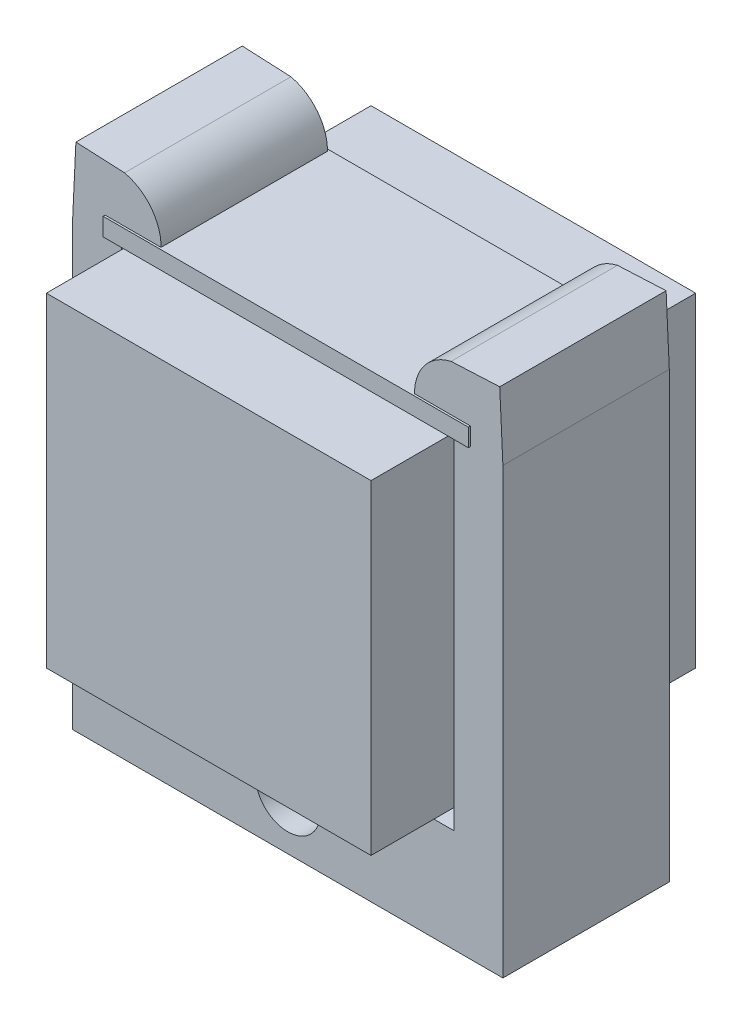
ISO-10303-21;
HEADER;
FILE_DESCRIPTION(('STEP AP214'),'2;1');
FILE_NAME('part.step','',(''),(''),'','','');
FILE_SCHEMA(('AUTOMOTIVE_DESIGN { 1 0 10303 214 1 1 1 1 }'));
ENDSEC;
DATA;
#1=APPLICATION_CONTEXT('core data for automotive mechanical design processes');
#2=APPLICATION_PROTOCOL_DEFINITION('international standard','automotive_design',2000,#1);
#3=PRODUCT_CONTEXT('',#1,'mechanical');
#4=PRODUCT('Part','Part','',(#3));
#5=PRODUCT_RELATED_PRODUCT_CATEGORY('part','',(#4));
#6=PRODUCT_DEFINITION_FORMATION('','',#4);
#7=PRODUCT_DEFINITION_CONTEXT('part definition',#1,'design');
#8=PRODUCT_DEFINITION('design','',#6,#7);
#9=PRODUCT_DEFINITION_SHAPE('','',#8);
#10=(LENGTH_UNIT() NAMED_UNIT(*) SI_UNIT(.MILLI.,.METRE.));
#11=(NAMED_UNIT(*) PLANE_ANGLE_UNIT() SI_UNIT($,.RADIAN.));
#12=(NAMED_UNIT(*) SI_UNIT($,.STERADIAN.) SOLID_ANGLE_UNIT());
#13=UNCERTAINTY_MEASURE_WITH_UNIT(LENGTH_MEASURE(1.E-05),#10,'distance_accuracy_value','');
#14=(GEOMETRIC_REPRESENTATION_CONTEXT(3) GLOBAL_UNCERTAINTY_ASSIGNED_CONTEXT((#13)) GLOBAL_UNIT_ASSIGNED_CONTEXT((#10,
#11,#12)) REPRESENTATION_CONTEXT('',''));
#15=CARTESIAN_POINT('',(0.,0.,0.));
#16=DIRECTION('',(0.,0.,1.));
#17=DIRECTION('',(1.,0.,0.));
#18=AXIS2_PLACEMENT_3D('',#15,#16,#17);
#19=CARTESIAN_POINT('',(-21.4167606150438,2.24614818602984,10.25));
#20=DIRECTION('',(0.,0.,-1.));
#21=DIRECTION('',(-1.,0.,0.));
#22=AXIS2_PLACEMENT_3D('',#19,#20,#21);
#23=CYLINDRICAL_SURFACE('',#22,5.80657591082073);
#24=CARTESIAN_POINT('',(-21.4167606150438,2.24614818602984,-10.25));
#25=DIRECTION('',(0.,0.,1.));
#26=DIRECTION('',(1.,0.,0.));
#27=AXIS2_PLACEMENT_3D('',#24,#25,#26);
#28=CIRCLE('',#27,5.80657591082073);
#29=CARTESIAN_POINT('',(-20.1167569484467,7.90532783284772,-10.25));
#30=VERTEX_POINT('',#29);
#31=CARTESIAN_POINT('',(-15.6167569484467,1.96995753523953,-10.25));
#32=VERTEX_POINT('',#31);
#33=EDGE_CURVE('E199',#30,#32,#28,.F.);
#34=ORIENTED_EDGE('',*,*,#33,.F.);
#35=DIRECTION('',(0.,0.,-1.));
#36=VECTOR('',#35,1.);
#37=CARTESIAN_POINT('',(-20.1167569484467,7.90532783284772,10.25));
#38=LINE('',#37,#36);
#39=CARTESIAN_POINT('',(-20.1167569484467,7.90532783284772,10.25));
#40=VERTEX_POINT('',#39);
#41=EDGE_CURVE('E12',#40,#30,#38,.T.);
#42=ORIENTED_EDGE('',*,*,#41,.F.);
#43=CARTESIAN_POINT('',(-21.4167606150438,2.24614818602984,10.25));
#44=DIRECTION('',(0.,0.,1.));
#45=DIRECTION('',(1.,0.,0.));
#46=AXIS2_PLACEMENT_3D('',#43,#44,#45);
#47=CIRCLE('',#46,5.80657591082073);
#48=CARTESIAN_POINT('',(-15.6167569484467,1.96995753523953,10.25));
#49=VERTEX_POINT('',#48);
#50=EDGE_CURVE('E242',#40,#49,#47,.F.);
#51=ORIENTED_EDGE('',*,*,#50,.T.);
#52=DIRECTION('',(0.,0.,-1.));
#53=VECTOR('',#52,1.);
#54=CARTESIAN_POINT('',(-15.6167569484467,1.96995753523953,10.25));
#55=LINE('',#54,#53);
#56=EDGE_CURVE('E70',#49,#32,#55,.T.);
#57=ORIENTED_EDGE('',*,*,#56,.T.);
#58=EDGE_LOOP('',(#34,#42,#51,#57));
#59=FACE_BOUND('',#58,.T.);
#60=ADVANCED_FACE('F54',(#59),#23,.T.);
#61=CARTESIAN_POINT('',(0.330079474075437,6.93166895558486,10.25));
#62=DIRECTION('',(0.0475651494154447,0.998868137724438,0.));
#63=DIRECTION('',(-0.998868137724438,0.0475651494154447,0.));
#64=AXIS2_PLACEMENT_3D('',#61,#62,#63);
#65=PLANE('',#64);
#66=DIRECTION('',(0.998868137724438,-0.0475651494154447,0.));
#67=VECTOR('',#66,1.);
#68=CARTESIAN_POINT('',(0.330079474075437,6.93166895558486,-10.25));
#69=LINE('',#68,#67);
#70=CARTESIAN_POINT('',(-26.1099657747934,8.19071872934039,-10.25));
#71=VERTEX_POINT('',#70);
#72=EDGE_CURVE('E201',#71,#30,#69,.T.);
#73=ORIENTED_EDGE('',*,*,#72,.F.);
#74=DIRECTION('',(0.,0.,-1.));
#75=VECTOR('',#74,1.);
#76=CARTESIAN_POINT('',(-26.1099657747934,8.19071872934039,10.25));
#77=LINE('',#76,#75);
#78=CARTESIAN_POINT('',(-26.1099657747934,8.19071872934039,10.25));
#79=VERTEX_POINT('',#78);
#80=EDGE_CURVE('E62',#79,#71,#77,.T.);
#81=ORIENTED_EDGE('',*,*,#80,.F.);
#82=DIRECTION('',(0.998868137724438,-0.0475651494154447,0.));
#83=VECTOR('',#82,1.);
#84=CARTESIAN_POINT('',(0.330079474075437,6.93166895558486,10.25));
#85=LINE('',#84,#83);
#86=EDGE_CURVE('E293',#79,#40,#85,.T.);
#87=ORIENTED_EDGE('',*,*,#86,.T.);
#88=ORIENTED_EDGE('',*,*,#41,.T.);
#89=EDGE_LOOP('',(#73,#81,#87,#88));
#90=FACE_BOUND('',#89,.T.);
#91=ADVANCED_FACE('F279',(#90),#65,.T.);
#92=CARTESIAN_POINT('',(-26.4400452488688,1.25904977375553,10.25));
#93=DIRECTION('',(-0.998868137724438,0.0475651494154446,0.));
#94=DIRECTION('',(-0.0475651494154446,-0.998868137724438,0.));
#95=AXIS2_PLACEMENT_3D('',#92,#93,#94);
#96=PLANE('',#95);
#97=DIRECTION('',(0.0475651494154446,0.998868137724438,0.));
#98=VECTOR('',#97,1.);
#99=CARTESIAN_POINT('',(-26.4400452488688,1.25904977375553,-10.25));
#100=LINE('',#99,#98);
#101=CARTESIAN_POINT('',(-26.5,0.,-10.25));
#102=VERTEX_POINT('',#101);
#103=EDGE_CURVE('E204',#102,#71,#100,.T.);
#104=ORIENTED_EDGE('',*,*,#103,.F.);
#105=DIRECTION('',(0.,0.,-1.));
#106=VECTOR('',#105,1.);
#107=CARTESIAN_POINT('',(-26.5,0.,10.25));
#108=LINE('',#107,#106);
#109=CARTESIAN_POINT('',(-26.5,0.,10.25));
#110=VERTEX_POINT('',#109);
#111=EDGE_CURVE('E268',#110,#102,#108,.T.);
#112=ORIENTED_EDGE('',*,*,#111,.F.);
#113=DIRECTION('',(0.0475651494154446,0.998868137724438,0.));
#114=VECTOR('',#113,1.);
#115=CARTESIAN_POINT('',(-26.4400452488688,1.25904977375553,10.25));
#116=LINE('',#115,#114);
#117=EDGE_CURVE('E275',#110,#79,#116,.T.);
#118=ORIENTED_EDGE('',*,*,#117,.T.);
#119=ORIENTED_EDGE('',*,*,#80,.T.);
#120=EDGE_LOOP('',(#104,#112,#118,#119));
#121=FACE_BOUND('',#120,.T.);
#122=ADVANCED_FACE('F273',(#121),#96,.T.);
#123=CARTESIAN_POINT('',(-26.5,0.,10.25));
#124=DIRECTION('',(-1.,0.,0.));
#125=DIRECTION('',(0.,0.,1.));
#126=AXIS2_PLACEMENT_3D('',#123,#124,#125);
#127=PLANE('',#126);
#128=DIRECTION('',(0.,1.,0.));
#129=VECTOR('',#128,1.);
#130=CARTESIAN_POINT('',(-26.5,0.,-10.25));
#131=LINE('',#130,#129);
#132=CARTESIAN_POINT('',(-26.5,-54.7,-10.25));
#133=VERTEX_POINT('',#132);
#134=EDGE_CURVE('E207',#133,#102,#131,.T.);
#135=ORIENTED_EDGE('',*,*,#134,.F.);
#136=DIRECTION('',(0.,0.,-1.));
#137=VECTOR('',#136,1.);
#138=CARTESIAN_POINT('',(-26.5,-54.7,10.25));
#139=LINE('',#138,#137);
#140=CARTESIAN_POINT('',(-26.5,-54.7,10.25));
#141=VERTEX_POINT('',#140);
#142=EDGE_CURVE('E266',#141,#133,#139,.T.);
#143=ORIENTED_EDGE('',*,*,#142,.F.);
#144=DIRECTION('',(0.,1.,0.));
#145=VECTOR('',#144,1.);
#146=CARTESIAN_POINT('',(-26.5,0.,10.25));
#147=LINE('',#146,#145);
#148=EDGE_CURVE('E290',#141,#110,#147,.T.);
#149=ORIENTED_EDGE('',*,*,#148,.T.);
#150=ORIENTED_EDGE('',*,*,#111,.T.);
#151=EDGE_LOOP('',(#135,#143,#149,#150));
#152=FACE_BOUND('',#151,.T.);
#153=ADVANCED_FACE('F287',(#152),#127,.T.);
#154=CARTESIAN_POINT('',(0.,-54.7,10.25));
#155=DIRECTION('',(0.,-1.,0.));
#156=DIRECTION('',(0.,0.,-1.));
#157=AXIS2_PLACEMENT_3D('',#154,#155,#156);
#158=PLANE('',#157);
#159=DIRECTION('',(-1.,0.,0.));
#160=VECTOR('',#159,1.);
#161=CARTESIAN_POINT('',(0.,-54.7,-10.25));
#162=LINE('',#161,#160);
#163=CARTESIAN_POINT('',(26.5,-54.7,-10.25));
#164=VERTEX_POINT('',#163);
#165=EDGE_CURVE('E210',#164,#133,#162,.T.);
#166=ORIENTED_EDGE('',*,*,#165,.F.);
#167=DIRECTION('',(0.,0.,-1.));
#168=VECTOR('',#167,1.);
#169=CARTESIAN_POINT('',(26.5,-54.7,10.25));
#170=LINE('',#169,#168);
#171=CARTESIAN_POINT('',(26.5,-54.7,10.25));
#172=VERTEX_POINT('',#171);
#173=EDGE_CURVE('E264',#172,#164,#170,.T.);
#174=ORIENTED_EDGE('',*,*,#173,.F.);
#175=DIRECTION('',(-1.,0.,0.));
#176=VECTOR('',#175,1.);
#177=CARTESIAN_POINT('',(0.,-54.7,10.25));
#178=LINE('',#177,#176);
#179=EDGE_CURVE('E295',#172,#141,#178,.T.);
#180=ORIENTED_EDGE('',*,*,#179,.T.);
#181=ORIENTED_EDGE('',*,*,#142,.T.);
#182=EDGE_LOOP('',(#166,#174,#180,#181));
#183=FACE_BOUND('',#182,.T.);
#184=ADVANCED_FACE('F342',(#183),#158,.T.);
#185=CARTESIAN_POINT('',(26.5,0.,10.25));
#186=DIRECTION('',(-1.,0.,0.));
#187=DIRECTION('',(0.,0.,1.));
#188=AXIS2_PLACEMENT_3D('',#185,#186,#187);
#189=PLANE('',#188);
#190=DIRECTION('',(0.,1.,0.));
#191=VECTOR('',#190,1.);
#192=CARTESIAN_POINT('',(26.5,0.,-10.25));
#193=LINE('',#192,#191);
#194=CARTESIAN_POINT('',(26.5,0.,-10.25));
#195=VERTEX_POINT('',#194);
#196=EDGE_CURVE('E213',#164,#195,#193,.T.);
#197=ORIENTED_EDGE('',*,*,#196,.T.);
#198=DIRECTION('',(0.,0.,-1.));
#199=VECTOR('',#198,1.);
#200=CARTESIAN_POINT('',(26.5,0.,10.25));
#201=LINE('',#200,#199);
#202=CARTESIAN_POINT('',(26.5,0.,10.25));
#203=VERTEX_POINT('',#202);
#204=EDGE_CURVE('E261',#203,#195,#201,.T.);
#205=ORIENTED_EDGE('',*,*,#204,.F.);
#206=DIRECTION('',(0.,1.,0.));
#207=VECTOR('',#206,1.);
#208=CARTESIAN_POINT('',(26.5,0.,10.25));
#209=LINE('',#208,#207);
#210=EDGE_CURVE('E301',#172,#203,#209,.T.);
#211=ORIENTED_EDGE('',*,*,#210,.F.);
#212=ORIENTED_EDGE('',*,*,#173,.T.);
#213=EDGE_LOOP('',(#197,#205,#211,#212));
#214=FACE_BOUND('',#213,.T.);
#215=ADVANCED_FACE('F345',(#214),#189,.F.);
#216=CARTESIAN_POINT('',(26.4400452488688,1.25904977375553,10.25));
#217=DIRECTION('',(-0.998868137724438,-0.0475651494154446,0.));
#218=DIRECTION('',(0.0475651494154446,-0.998868137724438,0.));
#219=AXIS2_PLACEMENT_3D('',#216,#217,#218);
#220=PLANE('',#219);
#221=DIRECTION('',(-0.0475651494154446,0.998868137724438,0.));
#222=VECTOR('',#221,1.);
#223=CARTESIAN_POINT('',(26.4400452488688,1.25904977375553,-10.25));
#224=LINE('',#223,#222);
#225=CARTESIAN_POINT('',(26.1099657747934,8.19071872934039,-10.25));
#226=VERTEX_POINT('',#225);
#227=EDGE_CURVE('E215',#195,#226,#224,.T.);
#228=ORIENTED_EDGE('',*,*,#227,.T.);
#229=DIRECTION('',(0.,0.,-1.));
#230=VECTOR('',#229,1.);
#231=CARTESIAN_POINT('',(26.1099657747934,8.19071872934039,10.25));
#232=LINE('',#231,#230);
#233=CARTESIAN_POINT('',(26.1099657747934,8.19071872934039,10.25));
#234=VERTEX_POINT('',#233);
#235=EDGE_CURVE('E258',#234,#226,#232,.T.);
#236=ORIENTED_EDGE('',*,*,#235,.F.);
#237=DIRECTION('',(-0.0475651494154446,0.998868137724438,0.));
#238=VECTOR('',#237,1.);
#239=CARTESIAN_POINT('',(26.4400452488688,1.25904977375553,10.25));
#240=LINE('',#239,#238);
#241=EDGE_CURVE('E303',#203,#234,#240,.T.);
#242=ORIENTED_EDGE('',*,*,#241,.F.);
#243=ORIENTED_EDGE('',*,*,#204,.T.);
#244=EDGE_LOOP('',(#228,#236,#242,#243));
#245=FACE_BOUND('',#244,.T.);
#246=ADVANCED_FACE('F349',(#245),#220,.F.);
#247=CARTESIAN_POINT('',(-0.330079474075437,6.93166895558486,10.25));
#248=DIRECTION('',(0.0475651494154447,-0.998868137724438,0.));
#249=DIRECTION('',(0.998868137724438,0.0475651494154447,0.));
#250=AXIS2_PLACEMENT_3D('',#247,#248,#249);
#251=PLANE('',#250);
#252=DIRECTION('',(-0.998868137724438,-0.0475651494154447,0.));
#253=VECTOR('',#252,1.);
#254=CARTESIAN_POINT('',(-0.330079474075437,6.93166895558486,-10.25));
#255=LINE('',#254,#253);
#256=CARTESIAN_POINT('',(20.1167569484467,7.90532783284772,-10.25));
#257=VERTEX_POINT('',#256);
#258=EDGE_CURVE('E217',#226,#257,#255,.T.);
#259=ORIENTED_EDGE('',*,*,#258,.T.);
#260=DIRECTION('',(0.,0.,-1.));
#261=VECTOR('',#260,1.);
#262=CARTESIAN_POINT('',(20.1167569484467,7.90532783284772,10.25));
#263=LINE('',#262,#261);
#264=CARTESIAN_POINT('',(20.1167569484467,7.90532783284772,10.25));
#265=VERTEX_POINT('',#264);
#266=EDGE_CURVE('E255',#265,#257,#263,.T.);
#267=ORIENTED_EDGE('',*,*,#266,.F.);
#268=DIRECTION('',(-0.998868137724438,-0.0475651494154447,0.));
#269=VECTOR('',#268,1.);
#270=CARTESIAN_POINT('',(-0.330079474075437,6.93166895558486,10.25));
#271=LINE('',#270,#269);
#272=EDGE_CURVE('E305',#234,#265,#271,.T.);
#273=ORIENTED_EDGE('',*,*,#272,.F.);
#274=ORIENTED_EDGE('',*,*,#235,.T.);
#275=EDGE_LOOP('',(#259,#267,#273,#274));
#276=FACE_BOUND('',#275,.T.);
#277=ADVANCED_FACE('F353',(#276),#251,.F.);
#278=CARTESIAN_POINT('',(21.4167606150438,2.24614818602984,10.25));
#279=DIRECTION('',(0.,0.,-1.));
#280=DIRECTION('',(-1.,0.,0.));
#281=AXIS2_PLACEMENT_3D('',#278,#279,#280);
#282=CYLINDRICAL_SURFACE('',#281,5.80657591082073);
#283=CARTESIAN_POINT('',(21.4167606150438,2.24614818602984,-10.25));
#284=DIRECTION('',(0.,0.,1.));
#285=DIRECTION('',(1.,0.,0.));
#286=AXIS2_PLACEMENT_3D('',#283,#284,#285);
#287=CIRCLE('',#286,5.80657591082073);
#288=CARTESIAN_POINT('',(15.6167569484467,1.96995753523953,-10.25));
#289=VERTEX_POINT('',#288);
#290=EDGE_CURVE('E219',#257,#289,#287,.T.);
#291=ORIENTED_EDGE('',*,*,#290,.T.);
#292=DIRECTION('',(0.,0.,-1.));
#293=VECTOR('',#292,1.);
#294=CARTESIAN_POINT('',(15.6167569484467,1.96995753523953,10.25));
#295=LINE('',#294,#293);
#296=CARTESIAN_POINT('',(15.6167569484467,1.96995753523953,10.25));
#297=VERTEX_POINT('',#296);
#298=EDGE_CURVE('E252',#297,#289,#295,.T.);
#299=ORIENTED_EDGE('',*,*,#298,.F.);
#300=CARTESIAN_POINT('',(21.4167606150438,2.24614818602984,10.25));
#301=DIRECTION('',(0.,0.,1.));
#302=DIRECTION('',(1.,0.,0.));
#303=AXIS2_PLACEMENT_3D('',#300,#301,#302);
#304=CIRCLE('',#303,5.80657591082073);
#305=EDGE_CURVE('E307',#265,#297,#304,.T.);
#306=ORIENTED_EDGE('',*,*,#305,.F.);
#307=ORIENTED_EDGE('',*,*,#266,.T.);
#308=EDGE_LOOP('',(#291,#299,#306,#307));
#309=FACE_BOUND('',#308,.T.);
#310=ADVANCED_FACE('F357',(#309),#282,.T.);
#311=CARTESIAN_POINT('',(-0.0582632382162501,1.22352800254136,10.25));
#312=DIRECTION('',(-0.0475651494154451,0.998868137724438,0.));
#313=DIRECTION('',(-0.998868137724438,-0.0475651494154451,0.));
#314=AXIS2_PLACEMENT_3D('',#311,#312,#313);
#315=PLANE('',#314);
#316=DIRECTION('',(0.998868137724438,0.0475651494154451,0.));
#317=VECTOR('',#316,1.);
#318=CARTESIAN_POINT('',(-0.0582632382162501,1.22352800254136,-10.25));
#319=LINE('',#318,#317);
#320=CARTESIAN_POINT('',(20.395356671286,2.19750990299376,-10.25));
#321=VERTEX_POINT('',#320);
#322=EDGE_CURVE('E221',#289,#321,#319,.T.);
#323=ORIENTED_EDGE('',*,*,#322,.T.);
#324=DIRECTION('',(0.,0.,-1.));
#325=VECTOR('',#324,1.);
#326=CARTESIAN_POINT('',(20.395356671286,2.19750990299376,10.25));
#327=LINE('',#326,#325);
#328=CARTESIAN_POINT('',(20.395356671286,2.19750990299376,10.25));
#329=VERTEX_POINT('',#328);
#330=EDGE_CURVE('E250',#329,#321,#327,.T.);
#331=ORIENTED_EDGE('',*,*,#330,.F.);
#332=DIRECTION('',(0.998868137724438,0.0475651494154451,0.));
#333=VECTOR('',#332,1.);
#334=CARTESIAN_POINT('',(-0.0582632382162501,1.22352800254136,10.25));
#335=LINE('',#334,#333);
#336=EDGE_CURVE('E309',#297,#329,#335,.T.);
#337=ORIENTED_EDGE('',*,*,#336,.F.);
#338=ORIENTED_EDGE('',*,*,#298,.T.);
#339=EDGE_LOOP('',(#323,#331,#337,#338));
#340=FACE_BOUND('',#339,.T.);
#341=ADVANCED_FACE('F361',(#340),#315,.F.);
#342=CARTESIAN_POINT('',(20.4536199095023,0.973981900452354,10.25));
#343=DIRECTION('',(-0.998868137724438,-0.0475651494154428,0.));
#344=DIRECTION('',(0.0475651494154428,-0.998868137724438,0.));
#345=AXIS2_PLACEMENT_3D('',#342,#343,#344);
#346=PLANE('',#345);
#347=DIRECTION('',(-0.0475651494154428,0.998868137724438,0.));
#348=VECTOR('',#347,1.);
#349=CARTESIAN_POINT('',(20.4536199095023,0.973981900452354,-10.25));
#350=LINE('',#349,#348);
#351=CARTESIAN_POINT('',(20.5,0.,-10.25));
#352=VERTEX_POINT('',#351);
#353=EDGE_CURVE('E224',#352,#321,#350,.T.);
#354=ORIENTED_EDGE('',*,*,#353,.F.);
#355=DIRECTION('',(0.,0.,-1.));
#356=VECTOR('',#355,1.);
#357=CARTESIAN_POINT('',(20.5,0.,10.25));
#358=LINE('',#357,#356);
#359=CARTESIAN_POINT('',(20.5,0.,10.25));
#360=VERTEX_POINT('',#359);
#361=EDGE_CURVE('E248',#360,#352,#358,.T.);
#362=ORIENTED_EDGE('',*,*,#361,.F.);
#363=DIRECTION('',(-0.0475651494154428,0.998868137724438,0.));
#364=VECTOR('',#363,1.);
#365=CARTESIAN_POINT('',(20.4536199095023,0.973981900452354,10.25));
#366=LINE('',#365,#364);
#367=EDGE_CURVE('E311',#360,#329,#366,.T.);
#368=ORIENTED_EDGE('',*,*,#367,.T.);
#369=ORIENTED_EDGE('',*,*,#330,.T.);
#370=EDGE_LOOP('',(#354,#362,#368,#369));
#371=FACE_BOUND('',#370,.T.);
#372=ADVANCED_FACE('F365',(#371),#346,.T.);
#373=CARTESIAN_POINT('',(20.5,0.,10.25));
#374=DIRECTION('',(-1.,0.,0.));
#375=DIRECTION('',(0.,0.,1.));
#376=AXIS2_PLACEMENT_3D('',#373,#374,#375);
#377=PLANE('',#376);
#378=DIRECTION('',(0.,1.,0.));
#379=VECTOR('',#378,1.);
#380=CARTESIAN_POINT('',(20.5,0.,-10.25));
#381=LINE('',#380,#379);
#382=CARTESIAN_POINT('',(20.5,-42.,-10.25));
#383=VERTEX_POINT('',#382);
#384=EDGE_CURVE('E227',#383,#352,#381,.T.);
#385=ORIENTED_EDGE('',*,*,#384,.F.);
#386=DIRECTION('',(0.,0.,-1.));
#387=VECTOR('',#386,1.);
#388=CARTESIAN_POINT('',(20.5,-42.,10.25));
#389=LINE('',#388,#387);
#390=CARTESIAN_POINT('',(20.5,-42.,10.25));
#391=VERTEX_POINT('',#390);
#392=EDGE_CURVE('E246',#391,#383,#389,.T.);
#393=ORIENTED_EDGE('',*,*,#392,.F.);
#394=DIRECTION('',(0.,1.,0.));
#395=VECTOR('',#394,1.);
#396=CARTESIAN_POINT('',(20.5,0.,10.25));
#397=LINE('',#396,#395);
#398=EDGE_CURVE('E314',#391,#360,#397,.T.);
#399=ORIENTED_EDGE('',*,*,#398,.T.);
#400=ORIENTED_EDGE('',*,*,#361,.T.);
#401=EDGE_LOOP('',(#385,#393,#399,#400));
#402=FACE_BOUND('',#401,.T.);
#403=ADVANCED_FACE('F369',(#402),#377,.T.);
#404=CARTESIAN_POINT('',(0.,-42.,10.25));
#405=DIRECTION('',(0.,1.,0.));
#406=DIRECTION('',(0.,0.,1.));
#407=AXIS2_PLACEMENT_3D('',#404,#405,#406);
#408=PLANE('',#407);
#409=DIRECTION('',(1.,0.,0.));
#410=VECTOR('',#409,1.);
#411=CARTESIAN_POINT('',(0.,-42.,-10.25));
#412=LINE('',#411,#410);
#413=CARTESIAN_POINT('',(-20.5,-42.,-10.25));
#414=VERTEX_POINT('',#413);
#415=EDGE_CURVE('E230',#414,#383,#412,.T.);
#416=ORIENTED_EDGE('',*,*,#415,.F.);
#417=DIRECTION('',(0.,0.,-1.));
#418=VECTOR('',#417,1.);
#419=CARTESIAN_POINT('',(-20.5,-42.,10.25));
#420=LINE('',#419,#418);
#421=CARTESIAN_POINT('',(-20.5,-42.,10.25));
#422=VERTEX_POINT('',#421);
#423=EDGE_CURVE('E188',#422,#414,#420,.T.);
#424=ORIENTED_EDGE('',*,*,#423,.F.);
#425=DIRECTION('',(1.,0.,0.));
#426=VECTOR('',#425,1.);
#427=CARTESIAN_POINT('',(0.,-42.,10.25));
#428=LINE('',#427,#426);
#429=EDGE_CURVE('E178',#422,#391,#428,.T.);
#430=ORIENTED_EDGE('',*,*,#429,.T.);
#431=ORIENTED_EDGE('',*,*,#392,.T.);
#432=EDGE_LOOP('',(#416,#424,#430,#431));
#433=FACE_BOUND('',#432,.T.);
#434=ADVANCED_FACE('F318',(#433),#408,.T.);
#435=CARTESIAN_POINT('',(-20.5,0.,10.25));
#436=DIRECTION('',(-1.,0.,0.));
#437=DIRECTION('',(0.,0.,1.));
#438=AXIS2_PLACEMENT_3D('',#435,#436,#437);
#439=PLANE('',#438);
#440=DIRECTION('',(0.,1.,0.));
#441=VECTOR('',#440,1.);
#442=CARTESIAN_POINT('',(-20.5,0.,-10.25));
#443=LINE('',#442,#441);
#444=CARTESIAN_POINT('',(-20.5,0.,-10.25));
#445=VERTEX_POINT('',#444);
#446=EDGE_CURVE('E185',#414,#445,#443,.T.);
#447=ORIENTED_EDGE('',*,*,#446,.T.);
#448=DIRECTION('',(0.,0.,-1.));
#449=VECTOR('',#448,1.);
#450=CARTESIAN_POINT('',(-20.5,0.,10.25));
#451=LINE('',#450,#449);
#452=CARTESIAN_POINT('',(-20.5,0.,10.25));
#453=VERTEX_POINT('',#452);
#454=EDGE_CURVE('E182',#453,#445,#451,.T.);
#455=ORIENTED_EDGE('',*,*,#454,.F.);
#456=DIRECTION('',(0.,1.,0.));
#457=VECTOR('',#456,1.);
#458=CARTESIAN_POINT('',(-20.5,0.,10.25));
#459=LINE('',#458,#457);
#460=EDGE_CURVE('E169',#422,#453,#459,.T.);
#461=ORIENTED_EDGE('',*,*,#460,.F.);
#462=ORIENTED_EDGE('',*,*,#423,.T.);
#463=EDGE_LOOP('',(#447,#455,#461,#462));
#464=FACE_BOUND('',#463,.T.);
#465=ADVANCED_FACE('F183',(#464),#439,.F.);
#466=CARTESIAN_POINT('',(-20.4536199095023,0.973981900452354,10.25));
#467=DIRECTION('',(-0.998868137724438,0.0475651494154428,0.));
#468=DIRECTION('',(-0.0475651494154428,-0.998868137724438,0.));
#469=AXIS2_PLACEMENT_3D('',#466,#467,#468);
#470=PLANE('',#469);
#471=DIRECTION('',(0.0475651494154428,0.998868137724438,0.));
#472=VECTOR('',#471,1.);
#473=CARTESIAN_POINT('',(-20.4536199095023,0.973981900452354,-10.25));
#474=LINE('',#473,#472);
#475=CARTESIAN_POINT('',(-20.395356671286,2.19750990299376,-10.25));
#476=VERTEX_POINT('',#475);
#477=EDGE_CURVE('E234',#445,#476,#474,.T.);
#478=ORIENTED_EDGE('',*,*,#477,.T.);
#479=DIRECTION('',(0.,0.,-1.));
#480=VECTOR('',#479,1.);
#481=CARTESIAN_POINT('',(-20.395356671286,2.19750990299376,10.25));
#482=LINE('',#481,#480);
#483=CARTESIAN_POINT('',(-20.395356671286,2.19750990299376,10.25));
#484=VERTEX_POINT('',#483);
#485=EDGE_CURVE('E120',#484,#476,#482,.T.);
#486=ORIENTED_EDGE('',*,*,#485,.F.);
#487=DIRECTION('',(0.0475651494154428,0.998868137724438,0.));
#488=VECTOR('',#487,1.);
#489=CARTESIAN_POINT('',(-20.4536199095023,0.973981900452354,10.25));
#490=LINE('',#489,#488);
#491=EDGE_CURVE('E175',#453,#484,#490,.T.);
#492=ORIENTED_EDGE('',*,*,#491,.F.);
#493=ORIENTED_EDGE('',*,*,#454,.T.);
#494=EDGE_LOOP('',(#478,#486,#492,#493));
#495=FACE_BOUND('',#494,.T.);
#496=ADVANCED_FACE('F190',(#495),#470,.F.);
#497=CARTESIAN_POINT('',(0.0582632382162501,1.22352800254136,10.25));
#498=DIRECTION('',(-0.0475651494154451,-0.998868137724438,0.));
#499=DIRECTION('',(0.998868137724438,-0.0475651494154451,0.));
#500=AXIS2_PLACEMENT_3D('',#497,#498,#499);
#501=PLANE('',#500);
#502=DIRECTION('',(-0.998868137724438,0.0475651494154451,0.));
#503=VECTOR('',#502,1.);
#504=CARTESIAN_POINT('',(0.0582632382162501,1.22352800254136,-10.25));
#505=LINE('',#504,#503);
#506=EDGE_CURVE('E236',#32,#476,#505,.T.);
#507=ORIENTED_EDGE('',*,*,#506,.F.);
#508=ORIENTED_EDGE('',*,*,#56,.F.);
#509=DIRECTION('',(-0.998868137724438,0.0475651494154451,0.));
#510=VECTOR('',#509,1.);
#511=CARTESIAN_POINT('',(0.0582632382162501,1.22352800254136,10.25));
#512=LINE('',#511,#510);
#513=EDGE_CURVE('E191',#49,#484,#512,.T.);
#514=ORIENTED_EDGE('',*,*,#513,.T.);
#515=ORIENTED_EDGE('',*,*,#485,.T.);
#516=EDGE_LOOP('',(#507,#508,#514,#515));
#517=FACE_BOUND('',#516,.T.);
#518=ADVANCED_FACE('F320',(#517),#501,.T.);
#519=CARTESIAN_POINT('',(0.,-48.35,10.25));
#520=DIRECTION('',(0.,0.,-1.));
#521=DIRECTION('',(-1.,0.,0.));
#522=AXIS2_PLACEMENT_3D('',#519,#520,#521);
#523=CYLINDRICAL_SURFACE('',#522,4.);
#524=CARTESIAN_POINT('',(0.,-48.35,10.25));
#525=DIRECTION('',(0.,0.,1.));
#526=DIRECTION('',(1.,0.,0.));
#527=AXIS2_PLACEMENT_3D('',#524,#525,#526);
#528=CIRCLE('',#527,4.);
#529=CARTESIAN_POINT('',(4.,-48.35,10.25));
#530=VERTEX_POINT('',#529);
#531=EDGE_CURVE('E193',#530,#530,#528,.T.);
#532=ORIENTED_EDGE('',*,*,#531,.T.);
#533=EDGE_LOOP('',(#532));
#534=FACE_BOUND('',#533,.T.);
#535=CARTESIAN_POINT('',(0.,-48.35,-10.25));
#536=DIRECTION('',(0.,0.,1.));
#537=DIRECTION('',(1.,0.,0.));
#538=AXIS2_PLACEMENT_3D('',#535,#536,#537);
#539=CIRCLE('',#538,4.);
#540=CARTESIAN_POINT('',(4.,-48.35,-10.25));
#541=VERTEX_POINT('',#540);
#542=EDGE_CURVE('E239',#541,#541,#539,.T.);
#543=ORIENTED_EDGE('',*,*,#542,.F.);
#544=EDGE_LOOP('',(#543));
#545=FACE_BOUND('',#544,.T.);
#546=ADVANCED_FACE('F322',(#534,#545),#523,.F.);
#547=CARTESIAN_POINT('',(0.,0.,10.25));
#548=DIRECTION('',(0.,0.,1.));
#549=DIRECTION('',(1.,0.,0.));
#550=AXIS2_PLACEMENT_3D('',#547,#548,#549);
#551=PLANE('',#550);
#552=ORIENTED_EDGE('',*,*,#50,.F.);
#553=ORIENTED_EDGE('',*,*,#86,.F.);
#554=ORIENTED_EDGE('',*,*,#117,.F.);
#555=ORIENTED_EDGE('',*,*,#148,.F.);
#556=ORIENTED_EDGE('',*,*,#179,.F.);
#557=ORIENTED_EDGE('',*,*,#210,.T.);
#558=ORIENTED_EDGE('',*,*,#241,.T.);
#559=ORIENTED_EDGE('',*,*,#272,.T.);
#560=ORIENTED_EDGE('',*,*,#305,.T.);
#561=ORIENTED_EDGE('',*,*,#336,.T.);
#562=ORIENTED_EDGE('',*,*,#367,.F.);
#563=ORIENTED_EDGE('',*,*,#398,.F.);
#564=ORIENTED_EDGE('',*,*,#429,.F.);
#565=ORIENTED_EDGE('',*,*,#460,.T.);
#566=ORIENTED_EDGE('',*,*,#491,.T.);
#567=ORIENTED_EDGE('',*,*,#513,.F.);
#568=EDGE_LOOP('',(#552,#553,#554,#555,#556,#557,#558,#559,#560,#561,#562,#563,#564,#565,#566,#567));
#569=FACE_BOUND('',#568,.T.);
#570=ORIENTED_EDGE('',*,*,#531,.F.);
#571=EDGE_LOOP('',(#570));
#572=FACE_BOUND('',#571,.T.);
#573=ADVANCED_FACE('F171',(#569,#572),#551,.T.);
#574=CARTESIAN_POINT('',(0.,0.,-10.25));
#575=DIRECTION('',(0.,0.,1.));
#576=DIRECTION('',(1.,0.,0.));
#577=AXIS2_PLACEMENT_3D('',#574,#575,#576);
#578=PLANE('',#577);
#579=ORIENTED_EDGE('',*,*,#33,.T.);
#580=ORIENTED_EDGE('',*,*,#506,.T.);
#581=ORIENTED_EDGE('',*,*,#477,.F.);
#582=ORIENTED_EDGE('',*,*,#446,.F.);
#583=ORIENTED_EDGE('',*,*,#415,.T.);
#584=ORIENTED_EDGE('',*,*,#384,.T.);
#585=ORIENTED_EDGE('',*,*,#353,.T.);
#586=ORIENTED_EDGE('',*,*,#322,.F.);
#587=ORIENTED_EDGE('',*,*,#290,.F.);
#588=ORIENTED_EDGE('',*,*,#258,.F.);
#589=ORIENTED_EDGE('',*,*,#227,.F.);
#590=ORIENTED_EDGE('',*,*,#196,.F.);
#591=ORIENTED_EDGE('',*,*,#165,.T.);
#592=ORIENTED_EDGE('',*,*,#134,.T.);
#593=ORIENTED_EDGE('',*,*,#103,.T.);
#594=ORIENTED_EDGE('',*,*,#72,.T.);
#595=EDGE_LOOP('',(#579,#580,#581,#582,#583,#584,#585,#586,#587,#588,#589,#590,#591,#592,#593,#594));
#596=FACE_BOUND('',#595,.T.);
#597=ORIENTED_EDGE('',*,*,#542,.T.);
#598=EDGE_LOOP('',(#597));
#599=FACE_BOUND('',#598,.T.);
#600=ADVANCED_FACE('F281',(#596,#599),#578,.F.);
#601=CLOSED_SHELL('',(#60,#91,#122,#153,#184,#215,#246,#277,#310,#341,#372,#403,#434,#465,#496,
#518,#546,#573,#600));
#602=MANIFOLD_SOLID_BREP('B2',#601);
#603=CARTESIAN_POINT('',(20.,-40.,20.));
#604=DIRECTION('',(1.,0.,0.));
#605=DIRECTION('',(0.,0.,-1.));
#606=AXIS2_PLACEMENT_3D('',#603,#604,#605);
#607=PLANE('',#606);
#608=DIRECTION('',(0.,0.,-1.));
#609=VECTOR('',#608,1.);
#610=CARTESIAN_POINT('',(20.,0.,20.));
#611=LINE('',#610,#609);
#612=CARTESIAN_POINT('',(20.,0.,20.));
#613=VERTEX_POINT('',#612);
#614=CARTESIAN_POINT('',(20.,0.,-20.));
#615=VERTEX_POINT('',#614);
#616=EDGE_CURVE('E646',#613,#615,#611,.T.);
#617=ORIENTED_EDGE('',*,*,#616,.F.);
#618=DIRECTION('',(0.,1.,0.));
#619=VECTOR('',#618,1.);
#620=CARTESIAN_POINT('',(20.,-40.,20.));
#621=LINE('',#620,#619);
#622=CARTESIAN_POINT('',(20.,-40.,20.));
#623=VERTEX_POINT('',#622);
#624=EDGE_CURVE('E52',#623,#613,#621,.T.);
#625=ORIENTED_EDGE('',*,*,#624,.F.);
#626=DIRECTION('',(0.,0.,-1.));
#627=VECTOR('',#626,1.);
#628=CARTESIAN_POINT('',(20.,-40.,20.));
#629=LINE('',#628,#627);
#630=CARTESIAN_POINT('',(20.,-40.,-20.));
#631=VERTEX_POINT('',#630);
#632=EDGE_CURVE('E640',#623,#631,#629,.T.);
#633=ORIENTED_EDGE('',*,*,#632,.T.);
#634=DIRECTION('',(0.,1.,0.));
#635=VECTOR('',#634,1.);
#636=CARTESIAN_POINT('',(20.,-40.,-20.));
#637=LINE('',#636,#635);
#638=EDGE_CURVE('E585',#631,#615,#637,.T.);
#639=ORIENTED_EDGE('',*,*,#638,.T.);
#640=EDGE_LOOP('',(#617,#625,#633,#639));
#641=FACE_BOUND('',#640,.T.);
#642=ADVANCED_FACE('F582',(#641),#607,.T.);
#643=CARTESIAN_POINT('',(-20.,-40.,20.));
#644=DIRECTION('',(0.,0.,1.));
#645=DIRECTION('',(1.,0.,0.));
#646=AXIS2_PLACEMENT_3D('',#643,#644,#645);
#647=PLANE('',#646);
#648=DIRECTION('',(1.,0.,0.));
#649=VECTOR('',#648,1.);
#650=CARTESIAN_POINT('',(-20.,0.,20.));
#651=LINE('',#650,#649);
#652=CARTESIAN_POINT('',(-20.,0.,20.));
#653=VERTEX_POINT('',#652);
#654=EDGE_CURVE('E642',#653,#613,#651,.T.);
#655=ORIENTED_EDGE('',*,*,#654,.F.);
#656=DIRECTION('',(0.,1.,0.));
#657=VECTOR('',#656,1.);
#658=CARTESIAN_POINT('',(-20.,-40.,20.));
#659=LINE('',#658,#657);
#660=CARTESIAN_POINT('',(-20.,-40.,20.));
#661=VERTEX_POINT('',#660);
#662=EDGE_CURVE('E591',#661,#653,#659,.T.);
#663=ORIENTED_EDGE('',*,*,#662,.F.);
#664=DIRECTION('',(1.,0.,0.));
#665=VECTOR('',#664,1.);
#666=CARTESIAN_POINT('',(-20.,-40.,20.));
#667=LINE('',#666,#665);
#668=EDGE_CURVE('E637',#661,#623,#667,.T.);
#669=ORIENTED_EDGE('',*,*,#668,.T.);
#670=ORIENTED_EDGE('',*,*,#624,.T.);
#671=EDGE_LOOP('',(#655,#663,#669,#670));
#672=FACE_BOUND('',#671,.T.);
#673=ADVANCED_FACE('F656',(#672),#647,.T.);
#674=CARTESIAN_POINT('',(-20.,-40.,20.));
#675=DIRECTION('',(-1.,0.,0.));
#676=DIRECTION('',(0.,0.,1.));
#677=AXIS2_PLACEMENT_3D('',#674,#675,#676);
#678=PLANE('',#677);
#679=DIRECTION('',(0.,0.,1.));
#680=VECTOR('',#679,1.);
#681=CARTESIAN_POINT('',(-20.,0.,20.));
#682=LINE('',#681,#680);
#683=CARTESIAN_POINT('',(-20.,0.,-20.));
#684=VERTEX_POINT('',#683);
#685=EDGE_CURVE('E632',#684,#653,#682,.T.);
#686=ORIENTED_EDGE('',*,*,#685,.F.);
#687=DIRECTION('',(0.,1.,0.));
#688=VECTOR('',#687,1.);
#689=CARTESIAN_POINT('',(-20.,-40.,-20.));
#690=LINE('',#689,#688);
#691=CARTESIAN_POINT('',(-20.,-40.,-20.));
#692=VERTEX_POINT('',#691);
#693=EDGE_CURVE('E627',#692,#684,#690,.T.);
#694=ORIENTED_EDGE('',*,*,#693,.F.);
#695=DIRECTION('',(0.,0.,1.));
#696=VECTOR('',#695,1.);
#697=CARTESIAN_POINT('',(-20.,-40.,20.));
#698=LINE('',#697,#696);
#699=EDGE_CURVE('E630',#692,#661,#698,.T.);
#700=ORIENTED_EDGE('',*,*,#699,.T.);
#701=ORIENTED_EDGE('',*,*,#662,.T.);
#702=EDGE_LOOP('',(#686,#694,#700,#701));
#703=FACE_BOUND('',#702,.T.);
#704=ADVANCED_FACE('F629',(#703),#678,.T.);
#705=CARTESIAN_POINT('',(-20.,-40.,-20.));
#706=DIRECTION('',(0.,0.,-1.));
#707=DIRECTION('',(-1.,0.,0.));
#708=AXIS2_PLACEMENT_3D('',#705,#706,#707);
#709=PLANE('',#708);
#710=DIRECTION('',(-1.,0.,0.));
#711=VECTOR('',#710,1.);
#712=CARTESIAN_POINT('',(-20.,0.,-20.));
#713=LINE('',#712,#711);
#714=EDGE_CURVE('E649',#615,#684,#713,.T.);
#715=ORIENTED_EDGE('',*,*,#714,.F.);
#716=ORIENTED_EDGE('',*,*,#638,.F.);
#717=DIRECTION('',(-1.,0.,0.));
#718=VECTOR('',#717,1.);
#719=CARTESIAN_POINT('',(-20.,-40.,-20.));
#720=LINE('',#719,#718);
#721=EDGE_CURVE('E636',#631,#692,#720,.T.);
#722=ORIENTED_EDGE('',*,*,#721,.T.);
#723=ORIENTED_EDGE('',*,*,#693,.T.);
#724=EDGE_LOOP('',(#715,#716,#722,#723));
#725=FACE_BOUND('',#724,.T.);
#726=ADVANCED_FACE('F639',(#725),#709,.T.);
#727=CARTESIAN_POINT('',(0.,-40.,0.));
#728=DIRECTION('',(0.,-1.,0.));
#729=DIRECTION('',(0.,0.,-1.));
#730=AXIS2_PLACEMENT_3D('',#727,#728,#729);
#731=PLANE('',#730);
#732=ORIENTED_EDGE('',*,*,#632,.F.);
#733=ORIENTED_EDGE('',*,*,#668,.F.);
#734=ORIENTED_EDGE('',*,*,#699,.F.);
#735=ORIENTED_EDGE('',*,*,#721,.F.);
#736=EDGE_LOOP('',(#732,#733,#734,#735));
#737=FACE_BOUND('',#736,.T.);
#738=ADVANCED_FACE('F635',(#737),#731,.T.);
#739=CARTESIAN_POINT('',(0.,0.,0.));
#740=DIRECTION('',(0.,-1.,0.));
#741=DIRECTION('',(0.,0.,-1.));
#742=AXIS2_PLACEMENT_3D('',#739,#740,#741);
#743=PLANE('',#742);
#744=ORIENTED_EDGE('',*,*,#616,.T.);
#745=ORIENTED_EDGE('',*,*,#714,.T.);
#746=ORIENTED_EDGE('',*,*,#685,.T.);
#747=ORIENTED_EDGE('',*,*,#654,.T.);
#748=EDGE_LOOP('',(#744,#745,#746,#747));
#749=FACE_BOUND('',#748,.T.);
#750=ADVANCED_FACE('F655',(#749),#743,.F.);
#751=CLOSED_SHELL('',(#642,#673,#704,#726,#738,#750));
#752=MANIFOLD_SOLID_BREP('B6',#751);
#753=CARTESIAN_POINT('',(22.5,2.2,10.5));
#754=DIRECTION('',(-1.,0.,0.));
#755=DIRECTION('',(0.,0.,1.));
#756=AXIS2_PLACEMENT_3D('',#753,#754,#755);
#757=PLANE('',#756);
#758=DIRECTION('',(0.,0.,-1.));
#759=VECTOR('',#758,1.);
#760=CARTESIAN_POINT('',(22.5,0.,10.5));
#761=LINE('',#760,#759);
#762=CARTESIAN_POINT('',(22.5,0.,10.5));
#763=VERTEX_POINT('',#762);
#764=CARTESIAN_POINT('',(22.5,0.,-10.5));
#765=VERTEX_POINT('',#764);
#766=EDGE_CURVE('E781',#763,#765,#761,.T.);
#767=ORIENTED_EDGE('',*,*,#766,.T.);
#768=DIRECTION('',(0.,-1.,0.));
#769=VECTOR('',#768,1.);
#770=CARTESIAN_POINT('',(22.5,2.2,-10.5));
#771=LINE('',#770,#769);
#772=CARTESIAN_POINT('',(22.5,2.2,-10.5));
#773=VERTEX_POINT('',#772);
#774=EDGE_CURVE('E580',#773,#765,#771,.T.);
#775=ORIENTED_EDGE('',*,*,#774,.F.);
#776=DIRECTION('',(0.,0.,-1.));
#777=VECTOR('',#776,1.);
#778=CARTESIAN_POINT('',(22.5,2.2,10.5));
#779=LINE('',#778,#777);
#780=CARTESIAN_POINT('',(22.5,2.2,10.5));
#781=VERTEX_POINT('',#780);
#782=EDGE_CURVE('E769',#781,#773,#779,.T.);
#783=ORIENTED_EDGE('',*,*,#782,.F.);
#784=DIRECTION('',(0.,-1.,0.));
#785=VECTOR('',#784,1.);
#786=CARTESIAN_POINT('',(22.5,2.2,10.5));
#787=LINE('',#786,#785);
#788=EDGE_CURVE('E777',#781,#763,#787,.T.);
#789=ORIENTED_EDGE('',*,*,#788,.T.);
#790=EDGE_LOOP('',(#767,#775,#783,#789));
#791=FACE_BOUND('',#790,.T.);
#792=ADVANCED_FACE('F718',(#791),#757,.F.);
#793=CARTESIAN_POINT('',(-22.5,2.2,-10.5));
#794=DIRECTION('',(0.,0.,1.));
#795=DIRECTION('',(1.,0.,0.));
#796=AXIS2_PLACEMENT_3D('',#793,#794,#795);
#797=PLANE('',#796);
#798=DIRECTION('',(-1.,0.,0.));
#799=VECTOR('',#798,1.);
#800=CARTESIAN_POINT('',(-22.5,0.,-10.5));
#801=LINE('',#800,#799);
#802=CARTESIAN_POINT('',(-22.5,0.,-10.5));
#803=VERTEX_POINT('',#802);
#804=EDGE_CURVE('E773',#765,#803,#801,.T.);
#805=ORIENTED_EDGE('',*,*,#804,.T.);
#806=DIRECTION('',(0.,-1.,0.));
#807=VECTOR('',#806,1.);
#808=CARTESIAN_POINT('',(-22.5,2.2,-10.5));
#809=LINE('',#808,#807);
#810=CARTESIAN_POINT('',(-22.5,2.2,-10.5));
#811=VERTEX_POINT('',#810);
#812=EDGE_CURVE('E726',#811,#803,#809,.T.);
#813=ORIENTED_EDGE('',*,*,#812,.F.);
#814=DIRECTION('',(-1.,0.,0.));
#815=VECTOR('',#814,1.);
#816=CARTESIAN_POINT('',(-22.5,2.2,-10.5));
#817=LINE('',#816,#815);
#818=EDGE_CURVE('E764',#773,#811,#817,.T.);
#819=ORIENTED_EDGE('',*,*,#818,.F.);
#820=ORIENTED_EDGE('',*,*,#774,.T.);
#821=EDGE_LOOP('',(#805,#813,#819,#820));
#822=FACE_BOUND('',#821,.T.);
#823=ADVANCED_FACE('F772',(#822),#797,.F.);
#824=CARTESIAN_POINT('',(-22.5,2.2,10.5));
#825=DIRECTION('',(1.,0.,0.));
#826=DIRECTION('',(0.,0.,-1.));
#827=AXIS2_PLACEMENT_3D('',#824,#825,#826);
#828=PLANE('',#827);
#829=DIRECTION('',(0.,0.,1.));
#830=VECTOR('',#829,1.);
#831=CARTESIAN_POINT('',(-22.5,0.,10.5));
#832=LINE('',#831,#830);
#833=CARTESIAN_POINT('',(-22.5,0.,10.5));
#834=VERTEX_POINT('',#833);
#835=EDGE_CURVE('E751',#803,#834,#832,.T.);
#836=ORIENTED_EDGE('',*,*,#835,.T.);
#837=DIRECTION('',(0.,-1.,0.));
#838=VECTOR('',#837,1.);
#839=CARTESIAN_POINT('',(-22.5,2.2,10.5));
#840=LINE('',#839,#838);
#841=CARTESIAN_POINT('',(-22.5,2.2,10.5));
#842=VERTEX_POINT('',#841);
#843=EDGE_CURVE('E774',#842,#834,#840,.T.);
#844=ORIENTED_EDGE('',*,*,#843,.F.);
#845=DIRECTION('',(0.,0.,1.));
#846=VECTOR('',#845,1.);
#847=CARTESIAN_POINT('',(-22.5,2.2,10.5));
#848=LINE('',#847,#846);
#849=EDGE_CURVE('E767',#811,#842,#848,.T.);
#850=ORIENTED_EDGE('',*,*,#849,.F.);
#851=ORIENTED_EDGE('',*,*,#812,.T.);
#852=EDGE_LOOP('',(#836,#844,#850,#851));
#853=FACE_BOUND('',#852,.T.);
#854=ADVANCED_FACE('F775',(#853),#828,.F.);
#855=CARTESIAN_POINT('',(-22.5,2.2,10.5));
#856=DIRECTION('',(0.,0.,-1.));
#857=DIRECTION('',(-1.,0.,0.));
#858=AXIS2_PLACEMENT_3D('',#855,#856,#857);
#859=PLANE('',#858);
#860=DIRECTION('',(1.,0.,0.));
#861=VECTOR('',#860,1.);
#862=CARTESIAN_POINT('',(-22.5,0.,10.5));
#863=LINE('',#862,#861);
#864=EDGE_CURVE('E757',#834,#763,#863,.T.);
#865=ORIENTED_EDGE('',*,*,#864,.T.);
#866=ORIENTED_EDGE('',*,*,#788,.F.);
#867=DIRECTION('',(1.,0.,0.));
#868=VECTOR('',#867,1.);
#869=CARTESIAN_POINT('',(-22.5,2.2,10.5));
#870=LINE('',#869,#868);
#871=EDGE_CURVE('E734',#842,#781,#870,.T.);
#872=ORIENTED_EDGE('',*,*,#871,.F.);
#873=ORIENTED_EDGE('',*,*,#843,.T.);
#874=EDGE_LOOP('',(#865,#866,#872,#873));
#875=FACE_BOUND('',#874,.T.);
#876=ADVANCED_FACE('F788',(#875),#859,.F.);
#877=CARTESIAN_POINT('',(0.,2.2,0.));
#878=DIRECTION('',(0.,-1.,0.));
#879=DIRECTION('',(0.,0.,-1.));
#880=AXIS2_PLACEMENT_3D('',#877,#878,#879);
#881=PLANE('',#880);
#882=ORIENTED_EDGE('',*,*,#782,.T.);
#883=ORIENTED_EDGE('',*,*,#818,.T.);
#884=ORIENTED_EDGE('',*,*,#849,.T.);
#885=ORIENTED_EDGE('',*,*,#871,.T.);
#886=EDGE_LOOP('',(#882,#883,#884,#885));
#887=FACE_BOUND('',#886,.T.);
#888=ADVANCED_FACE('F765',(#887),#881,.F.);
#889=CARTESIAN_POINT('',(0.,0.,0.));
#890=DIRECTION('',(0.,-1.,0.));
#891=DIRECTION('',(0.,0.,-1.));
#892=AXIS2_PLACEMENT_3D('',#889,#890,#891);
#893=PLANE('',#892);
#894=ORIENTED_EDGE('',*,*,#766,.F.);
#895=ORIENTED_EDGE('',*,*,#864,.F.);
#896=ORIENTED_EDGE('',*,*,#835,.F.);
#897=ORIENTED_EDGE('',*,*,#804,.F.);
#898=EDGE_LOOP('',(#894,#895,#896,#897));
#899=FACE_BOUND('',#898,.T.);
#900=ADVANCED_FACE('F791',(#899),#893,.T.);
#901=CLOSED_SHELL('',(#792,#823,#854,#876,#888,#900));
#902=MANIFOLD_SOLID_BREP('B46',#901);
#903=ADVANCED_BREP_SHAPE_REPRESENTATION('',(#18,#602,#752,#902),#14);
#904=SHAPE_DEFINITION_REPRESENTATION(#9,#903);
ENDSEC;
END-ISO-10303-21;
